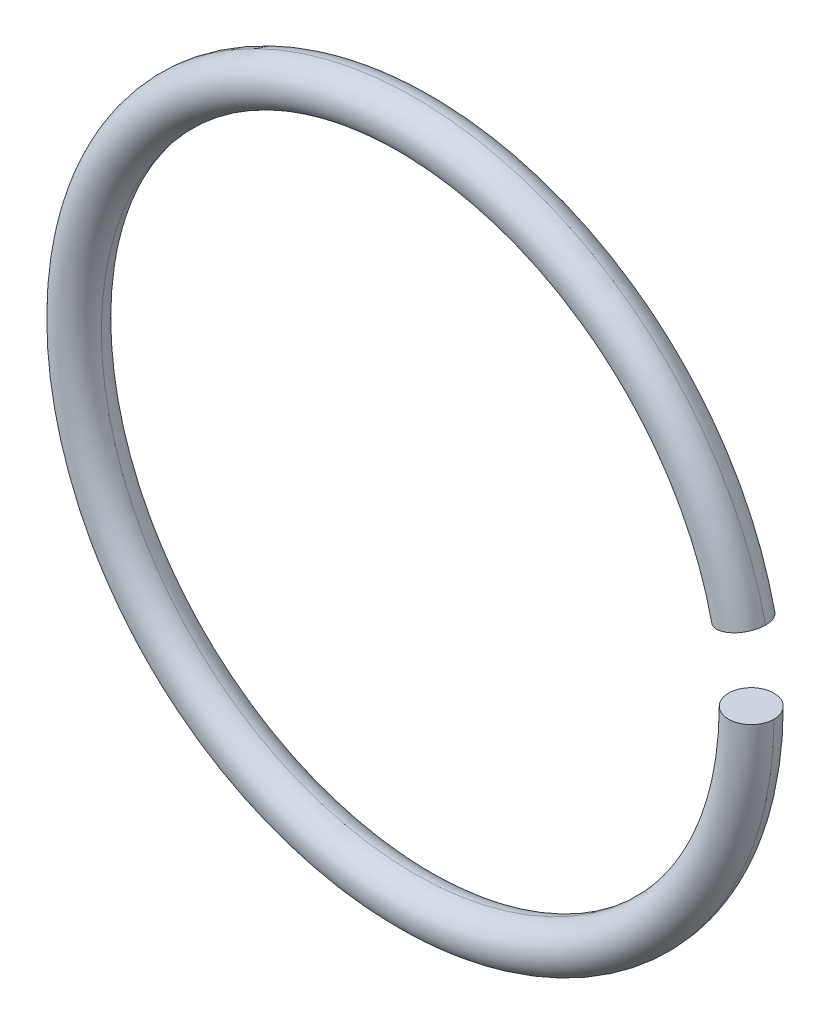
ISO-10303-21;
HEADER;
FILE_DESCRIPTION(('STEP AP214'),'2;1');
FILE_NAME('part.step','',(''),(''),'','','');
FILE_SCHEMA(('AUTOMOTIVE_DESIGN { 1 0 10303 214 1 1 1 1 }'));
ENDSEC;
DATA;
#1=APPLICATION_CONTEXT('core data for automotive mechanical design processes');
#2=APPLICATION_PROTOCOL_DEFINITION('international standard','automotive_design',2000,#1);
#3=PRODUCT_CONTEXT('',#1,'mechanical');
#4=PRODUCT('Part','Part','',(#3));
#5=PRODUCT_RELATED_PRODUCT_CATEGORY('part','',(#4));
#6=PRODUCT_DEFINITION_FORMATION('','',#4);
#7=PRODUCT_DEFINITION_CONTEXT('part definition',#1,'design');
#8=PRODUCT_DEFINITION('design','',#6,#7);
#9=PRODUCT_DEFINITION_SHAPE('','',#8);
#10=(LENGTH_UNIT() NAMED_UNIT(*) SI_UNIT(.MILLI.,.METRE.));
#11=(NAMED_UNIT(*) PLANE_ANGLE_UNIT() SI_UNIT($,.RADIAN.));
#12=(NAMED_UNIT(*) SI_UNIT($,.STERADIAN.) SOLID_ANGLE_UNIT());
#13=UNCERTAINTY_MEASURE_WITH_UNIT(LENGTH_MEASURE(1.E-05),#10,'distance_accuracy_value','');
#14=(GEOMETRIC_REPRESENTATION_CONTEXT(3) GLOBAL_UNCERTAINTY_ASSIGNED_CONTEXT((#13)) GLOBAL_UNIT_ASSIGNED_CONTEXT((#10,
#11,#12)) REPRESENTATION_CONTEXT('',''));
#15=CARTESIAN_POINT('',(0.,0.,0.));
#16=DIRECTION('',(0.,0.,1.));
#17=DIRECTION('',(1.,0.,0.));
#18=AXIS2_PLACEMENT_3D('',#15,#16,#17);
#19=CARTESIAN_POINT('',(0.,0.,0.));
#20=DIRECTION('',(0.,0.,1.));
#21=DIRECTION('',(1.,0.,0.));
#22=AXIS2_PLACEMENT_3D('',#19,#20,#21);
#23=TOROIDAL_SURFACE('',#22,14.85,1.);
#24=CARTESIAN_POINT('',(14.5016310651775,3.19768610865408,0.));
#25=DIRECTION('',(-0.215332397889164,0.976540812469864,0.));
#26=DIRECTION('',(0.,0.,1.));
#27=AXIS2_PLACEMENT_3D('',#24,#25,#26);
#28=CIRCLE('',#27,1.);
#29=CARTESIAN_POINT('',(15.4781718776474,3.41301850654324,0.));
#30=VERTEX_POINT('',#29);
#31=CARTESIAN_POINT('',(13.5250902527076,2.98235371076491,0.));
#32=VERTEX_POINT('',#31);
#33=EDGE_CURVE('E59',#30,#32,#28,.T.);
#34=ORIENTED_EDGE('',*,*,#33,.T.);
#35=CARTESIAN_POINT('',(0.,0.,0.));
#36=DIRECTION('',(0.,0.,1.));
#37=DIRECTION('',(-1.,0.,0.));
#38=AXIS2_PLACEMENT_3D('',#35,#36,#37);
#39=CIRCLE('',#38,13.85);
#40=CARTESIAN_POINT('',(13.85,0.,0.));
#41=VERTEX_POINT('',#40);
#42=EDGE_CURVE('E12',#32,#41,#39,.T.);
#43=ORIENTED_EDGE('',*,*,#42,.T.);
#44=CARTESIAN_POINT('',(14.85,0.,0.));
#45=DIRECTION('',(0.,1.,0.));
#46=DIRECTION('',(0.,0.,1.));
#47=AXIS2_PLACEMENT_3D('',#44,#45,#46);
#48=CIRCLE('',#47,1.);
#49=CARTESIAN_POINT('',(15.85,0.,0.));
#50=VERTEX_POINT('',#49);
#51=EDGE_CURVE('E60',#50,#41,#48,.T.);
#52=ORIENTED_EDGE('',*,*,#51,.F.);
#53=CARTESIAN_POINT('',(0.,0.,0.));
#54=DIRECTION('',(0.,0.,-1.));
#55=DIRECTION('',(1.,0.,0.));
#56=AXIS2_PLACEMENT_3D('',#53,#54,#55);
#57=CIRCLE('',#56,15.85);
#58=EDGE_CURVE('E39',#50,#30,#57,.T.);
#59=ORIENTED_EDGE('',*,*,#58,.T.);
#60=EDGE_LOOP('',(#34,#43,#52,#59));
#61=FACE_BOUND('',#60,.T.);
#62=ADVANCED_FACE('F31',(#61),#23,.T.);
#63=ORIENTED_EDGE('',*,*,#42,.F.);
#64=EDGE_CURVE('E55',#32,#30,#28,.T.);
#65=ORIENTED_EDGE('',*,*,#64,.T.);
#66=ORIENTED_EDGE('',*,*,#58,.F.);
#67=EDGE_CURVE('E65',#41,#50,#48,.T.);
#68=ORIENTED_EDGE('',*,*,#67,.F.);
#69=EDGE_LOOP('',(#63,#65,#66,#68));
#70=FACE_BOUND('',#69,.T.);
#71=ADVANCED_FACE('F33',(#70),#23,.T.);
#72=CARTESIAN_POINT('',(14.5016310651775,3.19768610865408,0.));
#73=DIRECTION('',(-0.215332397889164,0.976540812469864,0.));
#74=DIRECTION('',(0.,0.,1.));
#75=AXIS2_PLACEMENT_3D('',#72,#73,#74);
#76=PLANE('',#75);
#77=ORIENTED_EDGE('',*,*,#33,.F.);
#78=ORIENTED_EDGE('',*,*,#64,.F.);
#79=EDGE_LOOP('',(#77,#78));
#80=FACE_BOUND('',#79,.T.);
#81=ADVANCED_FACE('F63',(#80),#76,.F.);
#82=CARTESIAN_POINT('',(14.85,0.,0.));
#83=DIRECTION('',(0.,1.,0.));
#84=DIRECTION('',(0.,0.,1.));
#85=AXIS2_PLACEMENT_3D('',#82,#83,#84);
#86=PLANE('',#85);
#87=ORIENTED_EDGE('',*,*,#51,.T.);
#88=ORIENTED_EDGE('',*,*,#67,.T.);
#89=EDGE_LOOP('',(#87,#88));
#90=FACE_BOUND('',#89,.T.);
#91=ADVANCED_FACE('F67',(#90),#86,.T.);
#92=CLOSED_SHELL('',(#62,#71,#81,#91));
#93=MANIFOLD_SOLID_BREP('B2',#92);
#94=ADVANCED_BREP_SHAPE_REPRESENTATION('',(#18,#93),#14);
#95=SHAPE_DEFINITION_REPRESENTATION(#9,#94);
ENDSEC;
END-ISO-10303-21;
